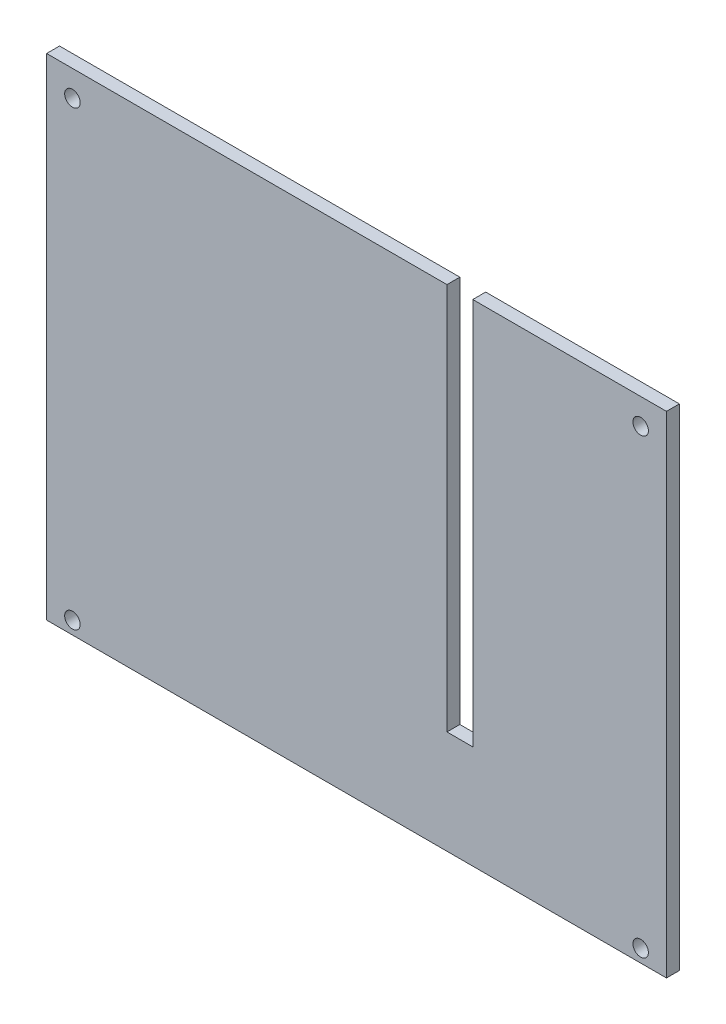
ISO-10303-21;
HEADER;
FILE_DESCRIPTION(('STEP AP214'),'2;1');
FILE_NAME('part.step','',(''),(''),'','','');
FILE_SCHEMA(('AUTOMOTIVE_DESIGN { 1 0 10303 214 1 1 1 1 }'));
ENDSEC;
DATA;
#1=APPLICATION_CONTEXT('core data for automotive mechanical design processes');
#2=APPLICATION_PROTOCOL_DEFINITION('international standard','automotive_design',2000,#1);
#3=PRODUCT_CONTEXT('',#1,'mechanical');
#4=PRODUCT('Part','Part','',(#3));
#5=PRODUCT_RELATED_PRODUCT_CATEGORY('part','',(#4));
#6=PRODUCT_DEFINITION_FORMATION('','',#4);
#7=PRODUCT_DEFINITION_CONTEXT('part definition',#1,'design');
#8=PRODUCT_DEFINITION('design','',#6,#7);
#9=PRODUCT_DEFINITION_SHAPE('','',#8);
#10=(LENGTH_UNIT() NAMED_UNIT(*) SI_UNIT(.MILLI.,.METRE.));
#11=(NAMED_UNIT(*) PLANE_ANGLE_UNIT() SI_UNIT($,.RADIAN.));
#12=(NAMED_UNIT(*) SI_UNIT($,.STERADIAN.) SOLID_ANGLE_UNIT());
#13=UNCERTAINTY_MEASURE_WITH_UNIT(LENGTH_MEASURE(1.E-05),#10,'distance_accuracy_value','');
#14=(GEOMETRIC_REPRESENTATION_CONTEXT(3) GLOBAL_UNCERTAINTY_ASSIGNED_CONTEXT((#13)) GLOBAL_UNIT_ASSIGNED_CONTEXT((#10,
#11,#12)) REPRESENTATION_CONTEXT('',''));
#15=CARTESIAN_POINT('',(0.,0.,0.));
#16=DIRECTION('',(0.,0.,1.));
#17=DIRECTION('',(1.,0.,0.));
#18=AXIS2_PLACEMENT_3D('',#15,#16,#17);
#19=CARTESIAN_POINT('',(0.,0.,5.));
#20=DIRECTION('',(0.,-1.,0.));
#21=DIRECTION('',(0.,0.,-1.));
#22=AXIS2_PLACEMENT_3D('',#19,#20,#21);
#23=PLANE('',#22);
#24=DIRECTION('',(-1.,0.,0.));
#25=VECTOR('',#24,1.);
#26=CARTESIAN_POINT('',(0.,0.,0.));
#27=LINE('',#26,#25);
#28=CARTESIAN_POINT('',(240.,0.,0.));
#29=VERTEX_POINT('',#28);
#30=CARTESIAN_POINT('',(165.,0.,0.));
#31=VERTEX_POINT('',#30);
#32=EDGE_CURVE('E121',#29,#31,#27,.T.);
#33=ORIENTED_EDGE('',*,*,#32,.T.);
#34=DIRECTION('',(0.,0.,1.));
#35=VECTOR('',#34,1.);
#36=CARTESIAN_POINT('',(165.,0.,0.));
#37=LINE('',#36,#35);
#38=CARTESIAN_POINT('',(165.,0.,5.));
#39=VERTEX_POINT('',#38);
#40=EDGE_CURVE('E148',#31,#39,#37,.T.);
#41=ORIENTED_EDGE('',*,*,#40,.T.);
#42=DIRECTION('',(-1.,0.,0.));
#43=VECTOR('',#42,1.);
#44=CARTESIAN_POINT('',(0.,0.,5.));
#45=LINE('',#44,#43);
#46=CARTESIAN_POINT('',(240.,0.,5.));
#47=VERTEX_POINT('',#46);
#48=EDGE_CURVE('E133',#47,#39,#45,.T.);
#49=ORIENTED_EDGE('',*,*,#48,.F.);
#50=DIRECTION('',(0.,0.,-1.));
#51=VECTOR('',#50,1.);
#52=CARTESIAN_POINT('',(240.,0.,5.));
#53=LINE('',#52,#51);
#54=EDGE_CURVE('E132',#47,#29,#53,.T.);
#55=ORIENTED_EDGE('',*,*,#54,.T.);
#56=EDGE_LOOP('',(#33,#41,#49,#55));
#57=FACE_BOUND('',#56,.T.);
#58=ADVANCED_FACE('F32',(#57),#23,.F.);
#59=CARTESIAN_POINT('',(0.,0.,5.));
#60=DIRECTION('',(1.,0.,0.));
#61=DIRECTION('',(0.,1.,0.));
#62=AXIS2_PLACEMENT_3D('',#59,#60,#61);
#63=PLANE('',#62);
#64=DIRECTION('',(0.,-1.,0.));
#65=VECTOR('',#64,1.);
#66=CARTESIAN_POINT('',(0.,0.,0.));
#67=LINE('',#66,#65);
#68=CARTESIAN_POINT('',(0.,0.,0.));
#69=VERTEX_POINT('',#68);
#70=CARTESIAN_POINT('',(0.,-190.,0.));
#71=VERTEX_POINT('',#70);
#72=EDGE_CURVE('E120',#69,#71,#67,.T.);
#73=ORIENTED_EDGE('',*,*,#72,.T.);
#74=DIRECTION('',(0.,0.,-1.));
#75=VECTOR('',#74,1.);
#76=CARTESIAN_POINT('',(0.,-190.,5.));
#77=LINE('',#76,#75);
#78=CARTESIAN_POINT('',(0.,-190.,5.));
#79=VERTEX_POINT('',#78);
#80=EDGE_CURVE('E11',#79,#71,#77,.T.);
#81=ORIENTED_EDGE('',*,*,#80,.F.);
#82=DIRECTION('',(0.,-1.,0.));
#83=VECTOR('',#82,1.);
#84=CARTESIAN_POINT('',(0.,0.,5.));
#85=LINE('',#84,#83);
#86=CARTESIAN_POINT('',(0.,0.,5.));
#87=VERTEX_POINT('',#86);
#88=EDGE_CURVE('E125',#87,#79,#85,.T.);
#89=ORIENTED_EDGE('',*,*,#88,.F.);
#90=DIRECTION('',(0.,0.,-1.));
#91=VECTOR('',#90,1.);
#92=CARTESIAN_POINT('',(0.,0.,5.));
#93=LINE('',#92,#91);
#94=EDGE_CURVE('E130',#87,#69,#93,.T.);
#95=ORIENTED_EDGE('',*,*,#94,.T.);
#96=EDGE_LOOP('',(#73,#81,#89,#95));
#97=FACE_BOUND('',#96,.T.);
#98=ADVANCED_FACE('F34',(#97),#63,.F.);
#99=CARTESIAN_POINT('',(0.,-190.,5.));
#100=DIRECTION('',(0.,1.,0.));
#101=DIRECTION('',(0.,0.,1.));
#102=AXIS2_PLACEMENT_3D('',#99,#100,#101);
#103=PLANE('',#102);
#104=DIRECTION('',(1.,0.,0.));
#105=VECTOR('',#104,1.);
#106=CARTESIAN_POINT('',(0.,-190.,0.));
#107=LINE('',#106,#105);
#108=CARTESIAN_POINT('',(240.,-190.,0.));
#109=VERTEX_POINT('',#108);
#110=EDGE_CURVE('E126',#71,#109,#107,.T.);
#111=ORIENTED_EDGE('',*,*,#110,.T.);
#112=DIRECTION('',(0.,0.,-1.));
#113=VECTOR('',#112,1.);
#114=CARTESIAN_POINT('',(240.,-190.,5.));
#115=LINE('',#114,#113);
#116=CARTESIAN_POINT('',(240.,-190.,5.));
#117=VERTEX_POINT('',#116);
#118=EDGE_CURVE('E40',#117,#109,#115,.T.);
#119=ORIENTED_EDGE('',*,*,#118,.F.);
#120=DIRECTION('',(1.,0.,0.));
#121=VECTOR('',#120,1.);
#122=CARTESIAN_POINT('',(0.,-190.,5.));
#123=LINE('',#122,#121);
#124=EDGE_CURVE('E85',#79,#117,#123,.T.);
#125=ORIENTED_EDGE('',*,*,#124,.F.);
#126=ORIENTED_EDGE('',*,*,#80,.T.);
#127=EDGE_LOOP('',(#111,#119,#125,#126));
#128=FACE_BOUND('',#127,.T.);
#129=ADVANCED_FACE('F155',(#128),#103,.F.);
#130=CARTESIAN_POINT('',(240.,0.,5.));
#131=DIRECTION('',(-1.,0.,0.));
#132=DIRECTION('',(0.,-1.,0.));
#133=AXIS2_PLACEMENT_3D('',#130,#131,#132);
#134=PLANE('',#133);
#135=DIRECTION('',(0.,1.,0.));
#136=VECTOR('',#135,1.);
#137=CARTESIAN_POINT('',(240.,0.,0.));
#138=LINE('',#137,#136);
#139=EDGE_CURVE('E122',#109,#29,#138,.T.);
#140=ORIENTED_EDGE('',*,*,#139,.T.);
#141=ORIENTED_EDGE('',*,*,#54,.F.);
#142=DIRECTION('',(0.,1.,0.));
#143=VECTOR('',#142,1.);
#144=CARTESIAN_POINT('',(240.,0.,5.));
#145=LINE('',#144,#143);
#146=EDGE_CURVE('E141',#117,#47,#145,.T.);
#147=ORIENTED_EDGE('',*,*,#146,.F.);
#148=ORIENTED_EDGE('',*,*,#118,.T.);
#149=EDGE_LOOP('',(#140,#141,#147,#148));
#150=FACE_BOUND('',#149,.T.);
#151=ADVANCED_FACE('F139',(#150),#134,.F.);
#152=CARTESIAN_POINT('',(155.,0.,5.));
#153=VERTEX_POINT('',#152);
#154=EDGE_CURVE('E56',#153,#87,#45,.T.);
#155=ORIENTED_EDGE('',*,*,#154,.F.);
#156=DIRECTION('',(0.,0.,1.));
#157=VECTOR('',#156,1.);
#158=CARTESIAN_POINT('',(155.,0.,0.));
#159=LINE('',#158,#157);
#160=CARTESIAN_POINT('',(155.,0.,0.));
#161=VERTEX_POINT('',#160);
#162=EDGE_CURVE('E109',#161,#153,#159,.T.);
#163=ORIENTED_EDGE('',*,*,#162,.F.);
#164=EDGE_CURVE('E78',#161,#69,#27,.T.);
#165=ORIENTED_EDGE('',*,*,#164,.T.);
#166=ORIENTED_EDGE('',*,*,#94,.F.);
#167=EDGE_LOOP('',(#155,#163,#165,#166));
#168=FACE_BOUND('',#167,.T.);
#169=ADVANCED_FACE('F114',(#168),#23,.F.);
#170=CARTESIAN_POINT('',(0.,0.,5.));
#171=DIRECTION('',(0.,0.,1.));
#172=DIRECTION('',(1.,0.,0.));
#173=AXIS2_PLACEMENT_3D('',#170,#171,#172);
#174=PLANE('',#173);
#175=CARTESIAN_POINT('',(10.,-10.,5.));
#176=DIRECTION('',(0.,0.,1.));
#177=DIRECTION('',(1.,0.,0.));
#178=AXIS2_PLACEMENT_3D('',#175,#176,#177);
#179=CIRCLE('',#178,3.);
#180=CARTESIAN_POINT('',(13.,-10.,5.));
#181=VERTEX_POINT('',#180);
#182=EDGE_CURVE('E171',#181,#181,#179,.T.);
#183=ORIENTED_EDGE('',*,*,#182,.F.);
#184=EDGE_LOOP('',(#183));
#185=FACE_BOUND('',#184,.T.);
#186=CARTESIAN_POINT('',(230.,-185.,5.));
#187=DIRECTION('',(0.,0.,1.));
#188=DIRECTION('',(1.,0.,0.));
#189=AXIS2_PLACEMENT_3D('',#186,#187,#188);
#190=CIRCLE('',#189,2.99999999999997);
#191=CARTESIAN_POINT('',(233.,-185.,5.));
#192=VERTEX_POINT('',#191);
#193=EDGE_CURVE('E176',#192,#192,#190,.T.);
#194=ORIENTED_EDGE('',*,*,#193,.F.);
#195=EDGE_LOOP('',(#194));
#196=FACE_BOUND('',#195,.T.);
#197=CARTESIAN_POINT('',(230.,-10.,5.));
#198=DIRECTION('',(0.,0.,1.));
#199=DIRECTION('',(1.,0.,0.));
#200=AXIS2_PLACEMENT_3D('',#197,#198,#199);
#201=CIRCLE('',#200,2.99999999999997);
#202=CARTESIAN_POINT('',(233.,-10.,5.));
#203=VERTEX_POINT('',#202);
#204=EDGE_CURVE('E179',#203,#203,#201,.T.);
#205=ORIENTED_EDGE('',*,*,#204,.F.);
#206=EDGE_LOOP('',(#205));
#207=FACE_BOUND('',#206,.T.);
#208=CARTESIAN_POINT('',(10.,-185.,5.));
#209=DIRECTION('',(0.,0.,1.));
#210=DIRECTION('',(1.,0.,0.));
#211=AXIS2_PLACEMENT_3D('',#208,#209,#210);
#212=CIRCLE('',#211,3.);
#213=CARTESIAN_POINT('',(13.,-185.,5.));
#214=VERTEX_POINT('',#213);
#215=EDGE_CURVE('E182',#214,#214,#212,.T.);
#216=ORIENTED_EDGE('',*,*,#215,.F.);
#217=EDGE_LOOP('',(#216));
#218=FACE_BOUND('',#217,.T.);
#219=DIRECTION('',(0.,1.,0.));
#220=VECTOR('',#219,1.);
#221=CARTESIAN_POINT('',(165.,-150.,5.));
#222=LINE('',#221,#220);
#223=CARTESIAN_POINT('',(165.,-150.,5.));
#224=VERTEX_POINT('',#223);
#225=EDGE_CURVE('E112',#224,#39,#222,.T.);
#226=ORIENTED_EDGE('',*,*,#225,.F.);
#227=DIRECTION('',(1.,0.,0.));
#228=VECTOR('',#227,1.);
#229=CARTESIAN_POINT('',(155.,-150.,5.));
#230=LINE('',#229,#228);
#231=CARTESIAN_POINT('',(155.,-150.,5.));
#232=VERTEX_POINT('',#231);
#233=EDGE_CURVE('E166',#232,#224,#230,.T.);
#234=ORIENTED_EDGE('',*,*,#233,.F.);
#235=DIRECTION('',(0.,-1.,0.));
#236=VECTOR('',#235,1.);
#237=CARTESIAN_POINT('',(155.,0.,5.));
#238=LINE('',#237,#236);
#239=EDGE_CURVE('E169',#153,#232,#238,.T.);
#240=ORIENTED_EDGE('',*,*,#239,.F.);
#241=ORIENTED_EDGE('',*,*,#154,.T.);
#242=ORIENTED_EDGE('',*,*,#88,.T.);
#243=ORIENTED_EDGE('',*,*,#124,.T.);
#244=ORIENTED_EDGE('',*,*,#146,.T.);
#245=ORIENTED_EDGE('',*,*,#48,.T.);
#246=EDGE_LOOP('',(#226,#234,#240,#241,#242,#243,#244,#245));
#247=FACE_BOUND('',#246,.T.);
#248=ADVANCED_FACE('F203',(#185,#196,#207,#218,#247),#174,.T.);
#249=CARTESIAN_POINT('',(0.,0.,0.));
#250=DIRECTION('',(0.,0.,1.));
#251=DIRECTION('',(1.,0.,0.));
#252=AXIS2_PLACEMENT_3D('',#249,#250,#251);
#253=PLANE('',#252);
#254=CARTESIAN_POINT('',(10.,-10.,0.));
#255=DIRECTION('',(0.,0.,-1.));
#256=DIRECTION('',(-1.,0.,0.));
#257=AXIS2_PLACEMENT_3D('',#254,#255,#256);
#258=CIRCLE('',#257,3.);
#259=CARTESIAN_POINT('',(7.,-10.,0.));
#260=VERTEX_POINT('',#259);
#261=EDGE_CURVE('E188',#260,#260,#258,.T.);
#262=ORIENTED_EDGE('',*,*,#261,.F.);
#263=EDGE_LOOP('',(#262));
#264=FACE_BOUND('',#263,.T.);
#265=CARTESIAN_POINT('',(230.,-185.,0.));
#266=DIRECTION('',(0.,0.,-1.));
#267=DIRECTION('',(1.,0.,0.));
#268=AXIS2_PLACEMENT_3D('',#265,#266,#267);
#269=CIRCLE('',#268,2.99999999999997);
#270=CARTESIAN_POINT('',(233.,-185.,0.));
#271=VERTEX_POINT('',#270);
#272=EDGE_CURVE('E189',#271,#271,#269,.T.);
#273=ORIENTED_EDGE('',*,*,#272,.F.);
#274=EDGE_LOOP('',(#273));
#275=FACE_BOUND('',#274,.T.);
#276=CARTESIAN_POINT('',(230.,-10.,0.));
#277=DIRECTION('',(0.,0.,-1.));
#278=DIRECTION('',(1.,0.,0.));
#279=AXIS2_PLACEMENT_3D('',#276,#277,#278);
#280=CIRCLE('',#279,2.99999999999997);
#281=CARTESIAN_POINT('',(233.,-10.,0.));
#282=VERTEX_POINT('',#281);
#283=EDGE_CURVE('E192',#282,#282,#280,.T.);
#284=ORIENTED_EDGE('',*,*,#283,.F.);
#285=EDGE_LOOP('',(#284));
#286=FACE_BOUND('',#285,.T.);
#287=CARTESIAN_POINT('',(10.,-185.,0.));
#288=DIRECTION('',(0.,0.,-1.));
#289=DIRECTION('',(-1.,0.,0.));
#290=AXIS2_PLACEMENT_3D('',#287,#288,#289);
#291=CIRCLE('',#290,3.);
#292=CARTESIAN_POINT('',(7.,-185.,0.));
#293=VERTEX_POINT('',#292);
#294=EDGE_CURVE('E185',#293,#293,#291,.T.);
#295=ORIENTED_EDGE('',*,*,#294,.F.);
#296=EDGE_LOOP('',(#295));
#297=FACE_BOUND('',#296,.T.);
#298=DIRECTION('',(1.,0.,0.));
#299=VECTOR('',#298,1.);
#300=CARTESIAN_POINT('',(155.,-150.,0.));
#301=LINE('',#300,#299);
#302=CARTESIAN_POINT('',(155.,-150.,0.));
#303=VERTEX_POINT('',#302);
#304=CARTESIAN_POINT('',(165.,-150.,0.));
#305=VERTEX_POINT('',#304);
#306=EDGE_CURVE('E47',#303,#305,#301,.T.);
#307=ORIENTED_EDGE('',*,*,#306,.T.);
#308=DIRECTION('',(0.,1.,0.));
#309=VECTOR('',#308,1.);
#310=CARTESIAN_POINT('',(165.,-150.,0.));
#311=LINE('',#310,#309);
#312=EDGE_CURVE('E115',#305,#31,#311,.T.);
#313=ORIENTED_EDGE('',*,*,#312,.T.);
#314=ORIENTED_EDGE('',*,*,#32,.F.);
#315=ORIENTED_EDGE('',*,*,#139,.F.);
#316=ORIENTED_EDGE('',*,*,#110,.F.);
#317=ORIENTED_EDGE('',*,*,#72,.F.);
#318=ORIENTED_EDGE('',*,*,#164,.F.);
#319=DIRECTION('',(0.,-1.,0.));
#320=VECTOR('',#319,1.);
#321=CARTESIAN_POINT('',(155.,0.,0.));
#322=LINE('',#321,#320);
#323=EDGE_CURVE('E106',#161,#303,#322,.T.);
#324=ORIENTED_EDGE('',*,*,#323,.T.);
#325=EDGE_LOOP('',(#307,#313,#314,#315,#316,#317,#318,#324));
#326=FACE_BOUND('',#325,.T.);
#327=ADVANCED_FACE('F118',(#264,#275,#286,#297,#326),#253,.F.);
#328=CARTESIAN_POINT('',(165.,-150.,0.));
#329=DIRECTION('',(1.,0.,0.));
#330=DIRECTION('',(0.,0.,-1.));
#331=AXIS2_PLACEMENT_3D('',#328,#329,#330);
#332=PLANE('',#331);
#333=ORIENTED_EDGE('',*,*,#225,.T.);
#334=ORIENTED_EDGE('',*,*,#40,.F.);
#335=ORIENTED_EDGE('',*,*,#312,.F.);
#336=DIRECTION('',(0.,0.,1.));
#337=VECTOR('',#336,1.);
#338=CARTESIAN_POINT('',(165.,-150.,0.));
#339=LINE('',#338,#337);
#340=EDGE_CURVE('E162',#305,#224,#339,.T.);
#341=ORIENTED_EDGE('',*,*,#340,.T.);
#342=EDGE_LOOP('',(#333,#334,#335,#341));
#343=FACE_BOUND('',#342,.T.);
#344=ADVANCED_FACE('F202',(#343),#332,.F.);
#345=CARTESIAN_POINT('',(155.,-150.,0.));
#346=DIRECTION('',(0.,-1.,0.));
#347=DIRECTION('',(0.,0.,-1.));
#348=AXIS2_PLACEMENT_3D('',#345,#346,#347);
#349=PLANE('',#348);
#350=ORIENTED_EDGE('',*,*,#233,.T.);
#351=ORIENTED_EDGE('',*,*,#340,.F.);
#352=ORIENTED_EDGE('',*,*,#306,.F.);
#353=DIRECTION('',(0.,0.,1.));
#354=VECTOR('',#353,1.);
#355=CARTESIAN_POINT('',(155.,-150.,0.));
#356=LINE('',#355,#354);
#357=EDGE_CURVE('E110',#303,#232,#356,.T.);
#358=ORIENTED_EDGE('',*,*,#357,.T.);
#359=EDGE_LOOP('',(#350,#351,#352,#358));
#360=FACE_BOUND('',#359,.T.);
#361=ADVANCED_FACE('F219',(#360),#349,.F.);
#362=CARTESIAN_POINT('',(155.,0.,0.));
#363=DIRECTION('',(-1.,0.,0.));
#364=DIRECTION('',(0.,-1.,0.));
#365=AXIS2_PLACEMENT_3D('',#362,#363,#364);
#366=PLANE('',#365);
#367=ORIENTED_EDGE('',*,*,#239,.T.);
#368=ORIENTED_EDGE('',*,*,#357,.F.);
#369=ORIENTED_EDGE('',*,*,#323,.F.);
#370=ORIENTED_EDGE('',*,*,#162,.T.);
#371=EDGE_LOOP('',(#367,#368,#369,#370));
#372=FACE_BOUND('',#371,.T.);
#373=ADVANCED_FACE('F108',(#372),#366,.F.);
#374=CARTESIAN_POINT('',(10.,-185.,10.));
#375=DIRECTION('',(0.,0.,-1.));
#376=DIRECTION('',(-1.,0.,0.));
#377=AXIS2_PLACEMENT_3D('',#374,#375,#376);
#378=CYLINDRICAL_SURFACE('',#377,3.);
#379=ORIENTED_EDGE('',*,*,#215,.T.);
#380=EDGE_LOOP('',(#379));
#381=FACE_BOUND('',#380,.T.);
#382=ORIENTED_EDGE('',*,*,#294,.T.);
#383=EDGE_LOOP('',(#382));
#384=FACE_BOUND('',#383,.T.);
#385=ADVANCED_FACE('F208',(#381,#384),#378,.F.);
#386=CARTESIAN_POINT('',(230.,-10.,10.));
#387=DIRECTION('',(0.,0.,-1.));
#388=DIRECTION('',(-1.,0.,0.));
#389=AXIS2_PLACEMENT_3D('',#386,#387,#388);
#390=CYLINDRICAL_SURFACE('',#389,2.99999999999997);
#391=ORIENTED_EDGE('',*,*,#204,.T.);
#392=EDGE_LOOP('',(#391));
#393=FACE_BOUND('',#392,.T.);
#394=ORIENTED_EDGE('',*,*,#283,.T.);
#395=EDGE_LOOP('',(#394));
#396=FACE_BOUND('',#395,.T.);
#397=ADVANCED_FACE('F198',(#393,#396),#390,.F.);
#398=CARTESIAN_POINT('',(230.,-185.,10.));
#399=DIRECTION('',(0.,0.,-1.));
#400=DIRECTION('',(-1.,0.,0.));
#401=AXIS2_PLACEMENT_3D('',#398,#399,#400);
#402=CYLINDRICAL_SURFACE('',#401,2.99999999999997);
#403=ORIENTED_EDGE('',*,*,#193,.T.);
#404=EDGE_LOOP('',(#403));
#405=FACE_BOUND('',#404,.T.);
#406=ORIENTED_EDGE('',*,*,#272,.T.);
#407=EDGE_LOOP('',(#406));
#408=FACE_BOUND('',#407,.T.);
#409=ADVANCED_FACE('F216',(#405,#408),#402,.F.);
#410=CARTESIAN_POINT('',(10.,-10.,10.));
#411=DIRECTION('',(0.,0.,-1.));
#412=DIRECTION('',(-1.,0.,0.));
#413=AXIS2_PLACEMENT_3D('',#410,#411,#412);
#414=CYLINDRICAL_SURFACE('',#413,3.);
#415=ORIENTED_EDGE('',*,*,#182,.T.);
#416=EDGE_LOOP('',(#415));
#417=FACE_BOUND('',#416,.T.);
#418=ORIENTED_EDGE('',*,*,#261,.T.);
#419=EDGE_LOOP('',(#418));
#420=FACE_BOUND('',#419,.T.);
#421=ADVANCED_FACE('F307',(#417,#420),#414,.F.);
#422=CLOSED_SHELL('',(#58,#98,#129,#151,#169,#248,#327,#344,#361,#373,#385,#397,#409,#421));
#423=MANIFOLD_SOLID_BREP('B2',#422);
#424=ADVANCED_BREP_SHAPE_REPRESENTATION('',(#18,#423),#14);
#425=SHAPE_DEFINITION_REPRESENTATION(#9,#424);
ENDSEC;
END-ISO-10303-21;
